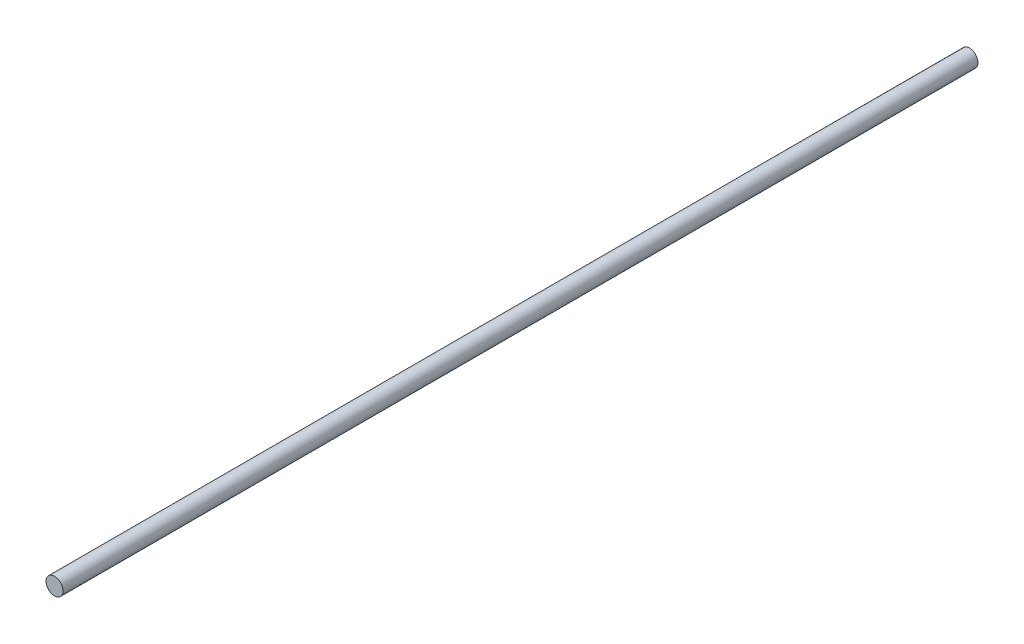
ISO-10303-21;
HEADER;
FILE_DESCRIPTION(('STEP AP214'),'2;1');
FILE_NAME('part.step','',(''),(''),'','','');
FILE_SCHEMA(('AUTOMOTIVE_DESIGN { 1 0 10303 214 1 1 1 1 }'));
ENDSEC;
DATA;
#1=APPLICATION_CONTEXT('core data for automotive mechanical design processes');
#2=APPLICATION_PROTOCOL_DEFINITION('international standard','automotive_design',2000,#1);
#3=PRODUCT_CONTEXT('',#1,'mechanical');
#4=PRODUCT('Part','Part','',(#3));
#5=PRODUCT_RELATED_PRODUCT_CATEGORY('part','',(#4));
#6=PRODUCT_DEFINITION_FORMATION('','',#4);
#7=PRODUCT_DEFINITION_CONTEXT('part definition',#1,'design');
#8=PRODUCT_DEFINITION('design','',#6,#7);
#9=PRODUCT_DEFINITION_SHAPE('','',#8);
#10=(LENGTH_UNIT() NAMED_UNIT(*) SI_UNIT(.MILLI.,.METRE.));
#11=(NAMED_UNIT(*) PLANE_ANGLE_UNIT() SI_UNIT($,.RADIAN.));
#12=(NAMED_UNIT(*) SI_UNIT($,.STERADIAN.) SOLID_ANGLE_UNIT());
#13=UNCERTAINTY_MEASURE_WITH_UNIT(LENGTH_MEASURE(1.E-05),#10,'distance_accuracy_value','');
#14=(GEOMETRIC_REPRESENTATION_CONTEXT(3) GLOBAL_UNCERTAINTY_ASSIGNED_CONTEXT((#13)) GLOBAL_UNIT_ASSIGNED_CONTEXT((#10,
#11,#12)) REPRESENTATION_CONTEXT('',''));
#15=CARTESIAN_POINT('',(0.,0.,0.));
#16=DIRECTION('',(0.,0.,1.));
#17=DIRECTION('',(1.,0.,0.));
#18=AXIS2_PLACEMENT_3D('',#15,#16,#17);
#19=CARTESIAN_POINT('',(0.,0.,430.));
#20=DIRECTION('',(0.,0.,-1.));
#21=DIRECTION('',(-1.,0.,0.));
#22=AXIS2_PLACEMENT_3D('',#19,#20,#21);
#23=CYLINDRICAL_SURFACE('',#22,4.);
#24=CARTESIAN_POINT('',(0.,0.,430.));
#25=DIRECTION('',(0.,0.,1.));
#26=DIRECTION('',(1.,0.,0.));
#27=AXIS2_PLACEMENT_3D('',#24,#25,#26);
#28=CIRCLE('',#27,4.);
#29=CARTESIAN_POINT('',(4.,0.,430.));
#30=VERTEX_POINT('',#29);
#31=EDGE_CURVE('E10',#30,#30,#28,.T.);
#32=ORIENTED_EDGE('',*,*,#31,.F.);
#33=EDGE_LOOP('',(#32));
#34=FACE_BOUND('',#33,.T.);
#35=CARTESIAN_POINT('',(0.,0.,0.));
#36=DIRECTION('',(0.,0.,1.));
#37=DIRECTION('',(1.,0.,0.));
#38=AXIS2_PLACEMENT_3D('',#35,#36,#37);
#39=CIRCLE('',#38,4.);
#40=CARTESIAN_POINT('',(4.,0.,0.));
#41=VERTEX_POINT('',#40);
#42=EDGE_CURVE('E36',#41,#41,#39,.T.);
#43=ORIENTED_EDGE('',*,*,#42,.T.);
#44=EDGE_LOOP('',(#43));
#45=FACE_BOUND('',#44,.T.);
#46=ADVANCED_FACE('F33',(#34,#45),#23,.T.);
#47=CARTESIAN_POINT('',(0.,0.,430.));
#48=DIRECTION('',(0.,0.,1.));
#49=DIRECTION('',(1.,0.,0.));
#50=AXIS2_PLACEMENT_3D('',#47,#48,#49);
#51=PLANE('',#50);
#52=ORIENTED_EDGE('',*,*,#31,.T.);
#53=EDGE_LOOP('',(#52));
#54=FACE_BOUND('',#53,.T.);
#55=ADVANCED_FACE('F48',(#54),#51,.T.);
#56=CARTESIAN_POINT('',(0.,0.,0.));
#57=DIRECTION('',(0.,0.,1.));
#58=DIRECTION('',(1.,0.,0.));
#59=AXIS2_PLACEMENT_3D('',#56,#57,#58);
#60=PLANE('',#59);
#61=ORIENTED_EDGE('',*,*,#42,.F.);
#62=EDGE_LOOP('',(#61));
#63=FACE_BOUND('',#62,.T.);
#64=ADVANCED_FACE('F46',(#63),#60,.F.);
#65=CLOSED_SHELL('',(#46,#55,#64));
#66=MANIFOLD_SOLID_BREP('B2',#65);
#67=ADVANCED_BREP_SHAPE_REPRESENTATION('',(#18,#66),#14);
#68=SHAPE_DEFINITION_REPRESENTATION(#9,#67);
ENDSEC;
END-ISO-10303-21;
